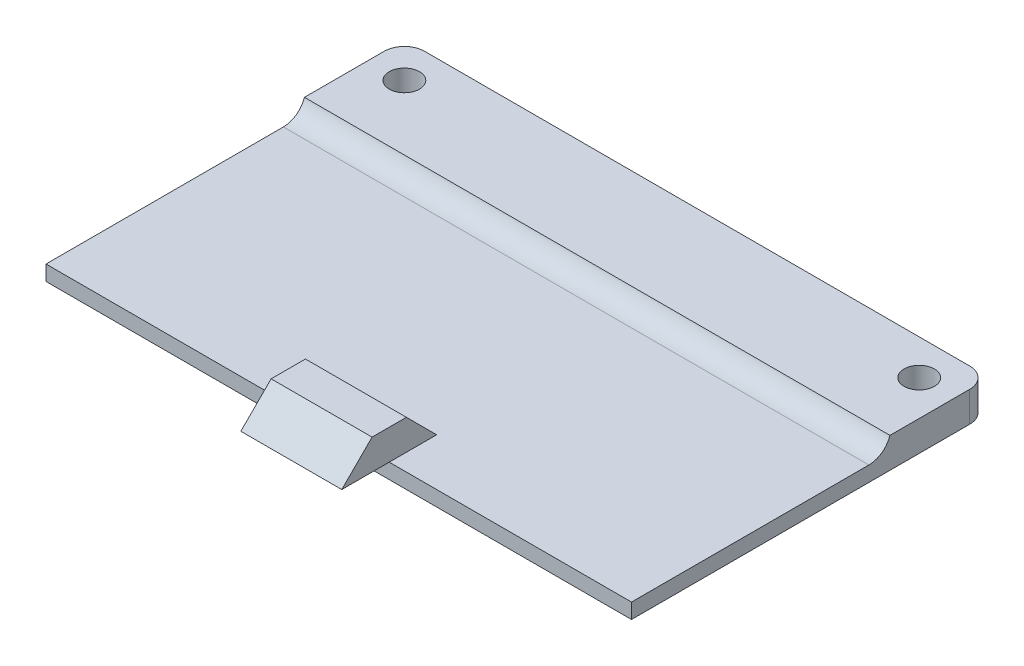
ISO-10303-21;
HEADER;
FILE_DESCRIPTION(('STEP AP214'),'2;1');
FILE_NAME('part.step','',(''),(''),'','','');
FILE_SCHEMA(('AUTOMOTIVE_DESIGN { 1 0 10303 214 1 1 1 1 }'));
ENDSEC;
DATA;
#1=APPLICATION_CONTEXT('core data for automotive mechanical design processes');
#2=APPLICATION_PROTOCOL_DEFINITION('international standard','automotive_design',2000,#1);
#3=PRODUCT_CONTEXT('',#1,'mechanical');
#4=PRODUCT('Part','Part','',(#3));
#5=PRODUCT_RELATED_PRODUCT_CATEGORY('part','',(#4));
#6=PRODUCT_DEFINITION_FORMATION('','',#4);
#7=PRODUCT_DEFINITION_CONTEXT('part definition',#1,'design');
#8=PRODUCT_DEFINITION('design','',#6,#7);
#9=PRODUCT_DEFINITION_SHAPE('','',#8);
#10=(LENGTH_UNIT() NAMED_UNIT(*) SI_UNIT(.MILLI.,.METRE.));
#11=(NAMED_UNIT(*) PLANE_ANGLE_UNIT() SI_UNIT($,.RADIAN.));
#12=(NAMED_UNIT(*) SI_UNIT($,.STERADIAN.) SOLID_ANGLE_UNIT());
#13=UNCERTAINTY_MEASURE_WITH_UNIT(LENGTH_MEASURE(1.E-05),#10,'distance_accuracy_value','');
#14=(GEOMETRIC_REPRESENTATION_CONTEXT(3) GLOBAL_UNCERTAINTY_ASSIGNED_CONTEXT((#13)) GLOBAL_UNIT_ASSIGNED_CONTEXT((#10,
#11,#12)) REPRESENTATION_CONTEXT('',''));
#15=CARTESIAN_POINT('',(0.,0.,0.));
#16=DIRECTION('',(0.,0.,1.));
#17=DIRECTION('',(1.,0.,0.));
#18=AXIS2_PLACEMENT_3D('',#15,#16,#17);
#19=CARTESIAN_POINT('',(0.,1.5,0.));
#20=DIRECTION('',(0.,-1.,0.));
#21=DIRECTION('',(0.,0.,-1.));
#22=AXIS2_PLACEMENT_3D('',#19,#20,#21);
#23=PLANE('',#22);
#24=DIRECTION('',(0.,0.,-1.));
#25=VECTOR('',#24,1.);
#26=CARTESIAN_POINT('',(5.,1.5,0.));
#27=LINE('',#26,#25);
#28=CARTESIAN_POINT('',(5.,1.5,17.75));
#29=VERTEX_POINT('',#28);
#30=CARTESIAN_POINT('',(5.,1.5,13.05));
#31=VERTEX_POINT('',#30);
#32=EDGE_CURVE('E153',#29,#31,#27,.T.);
#33=ORIENTED_EDGE('',*,*,#32,.F.);
#34=DIRECTION('',(1.,0.,0.));
#35=VECTOR('',#34,1.);
#36=CARTESIAN_POINT('',(-29.,1.5,17.75));
#37=LINE('',#36,#35);
#38=CARTESIAN_POINT('',(29.,1.5,17.75));
#39=VERTEX_POINT('',#38);
#40=EDGE_CURVE('E196',#29,#39,#37,.T.);
#41=ORIENTED_EDGE('',*,*,#40,.T.);
#42=DIRECTION('',(0.,0.,-1.));
#43=VECTOR('',#42,1.);
#44=CARTESIAN_POINT('',(29.,1.5,17.75));
#45=LINE('',#44,#43);
#46=CARTESIAN_POINT('',(29.,1.5,-5.76433463853857));
#47=VERTEX_POINT('',#46);
#48=EDGE_CURVE('E190',#39,#47,#45,.T.);
#49=ORIENTED_EDGE('',*,*,#48,.T.);
#50=DIRECTION('',(1.,0.,0.));
#51=VECTOR('',#50,1.);
#52=CARTESIAN_POINT('',(0.,1.5,-5.76433463853857));
#53=LINE('',#52,#51);
#54=CARTESIAN_POINT('',(-29.,1.5,-5.76433463853857));
#55=VERTEX_POINT('',#54);
#56=EDGE_CURVE('E213',#47,#55,#53,.F.);
#57=ORIENTED_EDGE('',*,*,#56,.T.);
#58=DIRECTION('',(0.,0.,1.));
#59=VECTOR('',#58,1.);
#60=CARTESIAN_POINT('',(-29.,1.5,17.75));
#61=LINE('',#60,#59);
#62=CARTESIAN_POINT('',(-29.,1.5,17.75));
#63=VERTEX_POINT('',#62);
#64=EDGE_CURVE('E193',#55,#63,#61,.T.);
#65=ORIENTED_EDGE('',*,*,#64,.T.);
#66=CARTESIAN_POINT('',(-5.00000000000001,1.5,17.75));
#67=VERTEX_POINT('',#66);
#68=EDGE_CURVE('E197',#63,#67,#37,.T.);
#69=ORIENTED_EDGE('',*,*,#68,.T.);
#70=DIRECTION('',(0.,0.,-1.));
#71=VECTOR('',#70,1.);
#72=CARTESIAN_POINT('',(-5.,1.5,0.));
#73=LINE('',#72,#71);
#74=CARTESIAN_POINT('',(-5.,1.5,13.05));
#75=VERTEX_POINT('',#74);
#76=EDGE_CURVE('E165',#67,#75,#73,.T.);
#77=ORIENTED_EDGE('',*,*,#76,.T.);
#78=DIRECTION('',(1.,0.,0.));
#79=VECTOR('',#78,1.);
#80=CARTESIAN_POINT('',(0.,1.5,13.05));
#81=LINE('',#80,#79);
#82=EDGE_CURVE('E152',#75,#31,#81,.T.);
#83=ORIENTED_EDGE('',*,*,#82,.T.);
#84=EDGE_LOOP('',(#33,#41,#49,#57,#65,#69,#77,#83));
#85=FACE_BOUND('',#84,.T.);
#86=ADVANCED_FACE('F33',(#85),#23,.F.);
#87=CARTESIAN_POINT('',(0.,0.,0.));
#88=DIRECTION('',(0.,-1.,0.));
#89=DIRECTION('',(0.,0.,-1.));
#90=AXIS2_PLACEMENT_3D('',#87,#88,#89);
#91=PLANE('',#90);
#92=CARTESIAN_POINT('',(-25.5,0.,-14.25));
#93=DIRECTION('',(0.,1.,0.));
#94=DIRECTION('',(0.,0.,1.));
#95=AXIS2_PLACEMENT_3D('',#92,#93,#94);
#96=CIRCLE('',#95,1.5);
#97=CARTESIAN_POINT('',(-25.5,0.,-12.75));
#98=VERTEX_POINT('',#97);
#99=EDGE_CURVE('E186',#98,#98,#96,.T.);
#100=ORIENTED_EDGE('',*,*,#99,.T.);
#101=EDGE_LOOP('',(#100));
#102=FACE_BOUND('',#101,.T.);
#103=DIRECTION('',(-1.,0.,0.));
#104=VECTOR('',#103,1.);
#105=CARTESIAN_POINT('',(-29.,0.,-17.75));
#106=LINE('',#105,#104);
#107=CARTESIAN_POINT('',(27.,0.,-17.75));
#108=VERTEX_POINT('',#107);
#109=CARTESIAN_POINT('',(-27.,0.,-17.75));
#110=VERTEX_POINT('',#109);
#111=EDGE_CURVE('E202',#108,#110,#106,.T.);
#112=ORIENTED_EDGE('',*,*,#111,.F.);
#113=CARTESIAN_POINT('',(27.,0.,-15.75));
#114=DIRECTION('',(0.,-1.,0.));
#115=DIRECTION('',(0.,0.,-1.));
#116=AXIS2_PLACEMENT_3D('',#113,#114,#115);
#117=CIRCLE('',#116,2.);
#118=CARTESIAN_POINT('',(29.,0.,-15.75));
#119=VERTEX_POINT('',#118);
#120=EDGE_CURVE('E234',#108,#119,#117,.T.);
#121=ORIENTED_EDGE('',*,*,#120,.T.);
#122=DIRECTION('',(0.,0.,-1.));
#123=VECTOR('',#122,1.);
#124=CARTESIAN_POINT('',(29.,0.,17.75));
#125=LINE('',#124,#123);
#126=CARTESIAN_POINT('',(29.,0.,17.75));
#127=VERTEX_POINT('',#126);
#128=EDGE_CURVE('E189',#127,#119,#125,.T.);
#129=ORIENTED_EDGE('',*,*,#128,.F.);
#130=DIRECTION('',(1.,0.,0.));
#131=VECTOR('',#130,1.);
#132=CARTESIAN_POINT('',(-29.,0.,17.75));
#133=LINE('',#132,#131);
#134=CARTESIAN_POINT('',(-29.,0.,17.75));
#135=VERTEX_POINT('',#134);
#136=EDGE_CURVE('E194',#135,#127,#133,.T.);
#137=ORIENTED_EDGE('',*,*,#136,.F.);
#138=DIRECTION('',(0.,0.,1.));
#139=VECTOR('',#138,1.);
#140=CARTESIAN_POINT('',(-29.,0.,17.75));
#141=LINE('',#140,#139);
#142=CARTESIAN_POINT('',(-29.,0.,-15.75));
#143=VERTEX_POINT('',#142);
#144=EDGE_CURVE('E205',#143,#135,#141,.T.);
#145=ORIENTED_EDGE('',*,*,#144,.F.);
#146=CARTESIAN_POINT('',(-27.,0.,-15.75));
#147=DIRECTION('',(0.,-1.,0.));
#148=DIRECTION('',(0.,0.,-1.));
#149=AXIS2_PLACEMENT_3D('',#146,#147,#148);
#150=CIRCLE('',#149,2.);
#151=EDGE_CURVE('E232',#143,#110,#150,.T.);
#152=ORIENTED_EDGE('',*,*,#151,.T.);
#153=EDGE_LOOP('',(#112,#121,#129,#137,#145,#152));
#154=FACE_BOUND('',#153,.T.);
#155=CARTESIAN_POINT('',(25.5,0.,-14.25));
#156=DIRECTION('',(0.,1.,0.));
#157=DIRECTION('',(0.,0.,-1.));
#158=AXIS2_PLACEMENT_3D('',#155,#156,#157);
#159=CIRCLE('',#158,1.5);
#160=CARTESIAN_POINT('',(25.5,0.,-15.75));
#161=VERTEX_POINT('',#160);
#162=EDGE_CURVE('E183',#161,#161,#159,.T.);
#163=ORIENTED_EDGE('',*,*,#162,.T.);
#164=EDGE_LOOP('',(#163));
#165=FACE_BOUND('',#164,.T.);
#166=ADVANCED_FACE('F249',(#102,#154,#165),#91,.T.);
#167=CARTESIAN_POINT('',(29.,1.5,17.75));
#168=DIRECTION('',(-1.,0.,0.));
#169=DIRECTION('',(0.,0.,1.));
#170=AXIS2_PLACEMENT_3D('',#167,#168,#169);
#171=PLANE('',#170);
#172=ORIENTED_EDGE('',*,*,#128,.T.);
#173=DIRECTION('',(0.,-1.,0.));
#174=VECTOR('',#173,1.);
#175=CARTESIAN_POINT('',(29.,1.5,-15.75));
#176=LINE('',#175,#174);
#177=CARTESIAN_POINT('',(29.,3.,-15.75));
#178=VERTEX_POINT('',#177);
#179=EDGE_CURVE('E56',#119,#178,#176,.F.);
#180=ORIENTED_EDGE('',*,*,#179,.T.);
#181=DIRECTION('',(0.,0.,-1.));
#182=VECTOR('',#181,1.);
#183=CARTESIAN_POINT('',(29.,3.,0.));
#184=LINE('',#183,#182);
#185=CARTESIAN_POINT('',(29.,3.,-7.84999999999999));
#186=VERTEX_POINT('',#185);
#187=EDGE_CURVE('E179',#186,#178,#184,.T.);
#188=ORIENTED_EDGE('',*,*,#187,.F.);
#189=CARTESIAN_POINT('',(29.,3.7,-5.76433463853857));
#190=DIRECTION('',(-1.,0.,0.));
#191=DIRECTION('',(0.,0.,1.));
#192=AXIS2_PLACEMENT_3D('',#189,#190,#191);
#193=CIRCLE('',#192,2.2);
#194=EDGE_CURVE('E215',#186,#47,#193,.T.);
#195=ORIENTED_EDGE('',*,*,#194,.T.);
#196=ORIENTED_EDGE('',*,*,#48,.F.);
#197=DIRECTION('',(0.,-1.,0.));
#198=VECTOR('',#197,1.);
#199=CARTESIAN_POINT('',(29.,1.5,17.75));
#200=LINE('',#199,#198);
#201=EDGE_CURVE('E200',#39,#127,#200,.T.);
#202=ORIENTED_EDGE('',*,*,#201,.T.);
#203=EDGE_LOOP('',(#172,#180,#188,#195,#196,#202));
#204=FACE_BOUND('',#203,.T.);
#205=ADVANCED_FACE('F252',(#204),#171,.F.);
#206=CARTESIAN_POINT('',(-29.,1.5,-17.75));
#207=DIRECTION('',(0.,0.,1.));
#208=DIRECTION('',(1.,0.,0.));
#209=AXIS2_PLACEMENT_3D('',#206,#207,#208);
#210=PLANE('',#209);
#211=DIRECTION('',(-1.,0.,0.));
#212=VECTOR('',#211,1.);
#213=CARTESIAN_POINT('',(0.,3.,-17.75));
#214=LINE('',#213,#212);
#215=CARTESIAN_POINT('',(27.,3.,-17.75));
#216=VERTEX_POINT('',#215);
#217=CARTESIAN_POINT('',(-27.,3.,-17.75));
#218=VERTEX_POINT('',#217);
#219=EDGE_CURVE('E181',#216,#218,#214,.T.);
#220=ORIENTED_EDGE('',*,*,#219,.F.);
#221=DIRECTION('',(0.,-1.,0.));
#222=VECTOR('',#221,1.);
#223=CARTESIAN_POINT('',(27.,1.5,-17.75));
#224=LINE('',#223,#222);
#225=EDGE_CURVE('E229',#216,#108,#224,.T.);
#226=ORIENTED_EDGE('',*,*,#225,.T.);
#227=ORIENTED_EDGE('',*,*,#111,.T.);
#228=DIRECTION('',(0.,-1.,0.));
#229=VECTOR('',#228,1.);
#230=CARTESIAN_POINT('',(-27.,1.5,-17.75));
#231=LINE('',#230,#229);
#232=EDGE_CURVE('E227',#110,#218,#231,.F.);
#233=ORIENTED_EDGE('',*,*,#232,.T.);
#234=EDGE_LOOP('',(#220,#226,#227,#233));
#235=FACE_BOUND('',#234,.T.);
#236=ADVANCED_FACE('F243',(#235),#210,.F.);
#237=CARTESIAN_POINT('',(-29.,1.5,17.75));
#238=DIRECTION('',(1.,0.,0.));
#239=DIRECTION('',(0.,0.,-1.));
#240=AXIS2_PLACEMENT_3D('',#237,#238,#239);
#241=PLANE('',#240);
#242=DIRECTION('',(0.,0.,1.));
#243=VECTOR('',#242,1.);
#244=CARTESIAN_POINT('',(-29.,3.,0.));
#245=LINE('',#244,#243);
#246=CARTESIAN_POINT('',(-29.,3.,-15.75));
#247=VERTEX_POINT('',#246);
#248=CARTESIAN_POINT('',(-29.,3.,-7.84999999999999));
#249=VERTEX_POINT('',#248);
#250=EDGE_CURVE('E174',#247,#249,#245,.T.);
#251=ORIENTED_EDGE('',*,*,#250,.F.);
#252=DIRECTION('',(0.,-1.,0.));
#253=VECTOR('',#252,1.);
#254=CARTESIAN_POINT('',(-29.,1.5,-15.75));
#255=LINE('',#254,#253);
#256=EDGE_CURVE('E11',#247,#143,#255,.T.);
#257=ORIENTED_EDGE('',*,*,#256,.T.);
#258=ORIENTED_EDGE('',*,*,#144,.T.);
#259=DIRECTION('',(0.,-1.,0.));
#260=VECTOR('',#259,1.);
#261=CARTESIAN_POINT('',(-29.,1.5,17.75));
#262=LINE('',#261,#260);
#263=EDGE_CURVE('E210',#63,#135,#262,.T.);
#264=ORIENTED_EDGE('',*,*,#263,.F.);
#265=ORIENTED_EDGE('',*,*,#64,.F.);
#266=CARTESIAN_POINT('',(-29.,3.7,-5.76433463853857));
#267=DIRECTION('',(1.,0.,0.));
#268=DIRECTION('',(0.,0.,-1.));
#269=AXIS2_PLACEMENT_3D('',#266,#267,#268);
#270=CIRCLE('',#269,2.2);
#271=EDGE_CURVE('E217',#55,#249,#270,.T.);
#272=ORIENTED_EDGE('',*,*,#271,.T.);
#273=EDGE_LOOP('',(#251,#257,#258,#264,#265,#272));
#274=FACE_BOUND('',#273,.T.);
#275=ADVANCED_FACE('F262',(#274),#241,.F.);
#276=CARTESIAN_POINT('',(-29.,1.5,17.75));
#277=DIRECTION('',(0.,0.,-1.));
#278=DIRECTION('',(-1.,0.,0.));
#279=AXIS2_PLACEMENT_3D('',#276,#277,#278);
#280=PLANE('',#279);
#281=ORIENTED_EDGE('',*,*,#136,.T.);
#282=ORIENTED_EDGE('',*,*,#201,.F.);
#283=ORIENTED_EDGE('',*,*,#40,.F.);
#284=EDGE_CURVE('E151',#67,#29,#37,.T.);
#285=ORIENTED_EDGE('',*,*,#284,.F.);
#286=ORIENTED_EDGE('',*,*,#68,.F.);
#287=ORIENTED_EDGE('',*,*,#263,.T.);
#288=EDGE_LOOP('',(#281,#282,#283,#285,#286,#287));
#289=FACE_BOUND('',#288,.T.);
#290=ADVANCED_FACE('F256',(#289),#280,.F.);
#291=CARTESIAN_POINT('',(-25.5,1.5,-14.25));
#292=DIRECTION('',(0.,-1.,0.));
#293=DIRECTION('',(0.,0.,-1.));
#294=AXIS2_PLACEMENT_3D('',#291,#292,#293);
#295=CYLINDRICAL_SURFACE('',#294,1.5);
#296=ORIENTED_EDGE('',*,*,#99,.F.);
#297=EDGE_LOOP('',(#296));
#298=FACE_BOUND('',#297,.T.);
#299=CARTESIAN_POINT('',(-25.5,3.,-14.25));
#300=DIRECTION('',(0.,1.,0.));
#301=DIRECTION('',(0.,0.,1.));
#302=AXIS2_PLACEMENT_3D('',#299,#300,#301);
#303=CIRCLE('',#302,1.5);
#304=CARTESIAN_POINT('',(-25.5,3.,-12.75));
#305=VERTEX_POINT('',#304);
#306=EDGE_CURVE('E168',#305,#305,#303,.F.);
#307=ORIENTED_EDGE('',*,*,#306,.F.);
#308=EDGE_LOOP('',(#307));
#309=FACE_BOUND('',#308,.T.);
#310=ADVANCED_FACE('F280',(#298,#309),#295,.F.);
#311=CARTESIAN_POINT('',(25.5,1.5,-14.25));
#312=DIRECTION('',(0.,-1.,0.));
#313=DIRECTION('',(0.,0.,-1.));
#314=AXIS2_PLACEMENT_3D('',#311,#312,#313);
#315=CYLINDRICAL_SURFACE('',#314,1.5);
#316=ORIENTED_EDGE('',*,*,#162,.F.);
#317=EDGE_LOOP('',(#316));
#318=FACE_BOUND('',#317,.T.);
#319=CARTESIAN_POINT('',(25.5,3.,-14.25));
#320=DIRECTION('',(0.,1.,0.));
#321=DIRECTION('',(0.,0.,1.));
#322=AXIS2_PLACEMENT_3D('',#319,#320,#321);
#323=CIRCLE('',#322,1.5);
#324=CARTESIAN_POINT('',(25.5,3.,-12.75));
#325=VERTEX_POINT('',#324);
#326=EDGE_CURVE('E171',#325,#325,#323,.F.);
#327=ORIENTED_EDGE('',*,*,#326,.F.);
#328=EDGE_LOOP('',(#327));
#329=FACE_BOUND('',#328,.T.);
#330=ADVANCED_FACE('F325',(#318,#329),#315,.F.);
#331=CARTESIAN_POINT('',(0.,3.,0.));
#332=DIRECTION('',(0.,1.,0.));
#333=DIRECTION('',(0.,0.,1.));
#334=AXIS2_PLACEMENT_3D('',#331,#332,#333);
#335=PLANE('',#334);
#336=ORIENTED_EDGE('',*,*,#306,.T.);
#337=EDGE_LOOP('',(#336));
#338=FACE_BOUND('',#337,.T.);
#339=ORIENTED_EDGE('',*,*,#326,.T.);
#340=EDGE_LOOP('',(#339));
#341=FACE_BOUND('',#340,.T.);
#342=ORIENTED_EDGE('',*,*,#187,.T.);
#343=CARTESIAN_POINT('',(27.,3.,-15.75));
#344=DIRECTION('',(0.,1.,0.));
#345=DIRECTION('',(0.,0.,1.));
#346=AXIS2_PLACEMENT_3D('',#343,#344,#345);
#347=CIRCLE('',#346,2.);
#348=EDGE_CURVE('E41',#178,#216,#347,.T.);
#349=ORIENTED_EDGE('',*,*,#348,.T.);
#350=ORIENTED_EDGE('',*,*,#219,.T.);
#351=CARTESIAN_POINT('',(-27.,3.,-15.75));
#352=DIRECTION('',(0.,1.,0.));
#353=DIRECTION('',(0.,0.,1.));
#354=AXIS2_PLACEMENT_3D('',#351,#352,#353);
#355=CIRCLE('',#354,2.);
#356=EDGE_CURVE('E48',#218,#247,#355,.T.);
#357=ORIENTED_EDGE('',*,*,#356,.T.);
#358=ORIENTED_EDGE('',*,*,#250,.T.);
#359=DIRECTION('',(1.,0.,0.));
#360=VECTOR('',#359,1.);
#361=CARTESIAN_POINT('',(0.,3.,-7.84999999999999));
#362=LINE('',#361,#360);
#363=EDGE_CURVE('E176',#249,#186,#362,.T.);
#364=ORIENTED_EDGE('',*,*,#363,.T.);
#365=EDGE_LOOP('',(#342,#349,#350,#357,#358,#364));
#366=FACE_BOUND('',#365,.T.);
#367=ADVANCED_FACE('F239',(#338,#341,#366),#335,.T.);
#368=CARTESIAN_POINT('',(0.,3.7,-5.76433463853857));
#369=DIRECTION('',(1.,0.,0.));
#370=DIRECTION('',(0.,0.,-1.));
#371=AXIS2_PLACEMENT_3D('',#368,#369,#370);
#372=CYLINDRICAL_SURFACE('',#371,2.2);
#373=ORIENTED_EDGE('',*,*,#271,.F.);
#374=ORIENTED_EDGE('',*,*,#56,.F.);
#375=ORIENTED_EDGE('',*,*,#194,.F.);
#376=ORIENTED_EDGE('',*,*,#363,.F.);
#377=EDGE_LOOP('',(#373,#374,#375,#376));
#378=FACE_BOUND('',#377,.T.);
#379=ADVANCED_FACE('F291',(#378),#372,.F.);
#380=CARTESIAN_POINT('',(0.,1.5,0.));
#381=DIRECTION('',(0.,1.,0.));
#382=DIRECTION('',(0.,0.,1.));
#383=AXIS2_PLACEMENT_3D('',#380,#381,#382);
#384=PLANE('',#383);
#385=CARTESIAN_POINT('',(-5.,1.5,22.45));
#386=VERTEX_POINT('',#385);
#387=EDGE_CURVE('E166',#386,#67,#73,.T.);
#388=ORIENTED_EDGE('',*,*,#387,.T.);
#389=ORIENTED_EDGE('',*,*,#284,.T.);
#390=CARTESIAN_POINT('',(5.,1.5,22.45));
#391=VERTEX_POINT('',#390);
#392=EDGE_CURVE('E135',#391,#29,#27,.T.);
#393=ORIENTED_EDGE('',*,*,#392,.F.);
#394=DIRECTION('',(1.,0.,0.));
#395=VECTOR('',#394,1.);
#396=CARTESIAN_POINT('',(0.,1.5,22.45));
#397=LINE('',#396,#395);
#398=EDGE_CURVE('E149',#386,#391,#397,.T.);
#399=ORIENTED_EDGE('',*,*,#398,.F.);
#400=EDGE_LOOP('',(#388,#389,#393,#399));
#401=FACE_BOUND('',#400,.T.);
#402=ADVANCED_FACE('F148',(#401),#384,.F.);
#403=CARTESIAN_POINT('',(5.,4.5,0.));
#404=DIRECTION('',(-1.,0.,0.));
#405=DIRECTION('',(0.,0.,1.));
#406=AXIS2_PLACEMENT_3D('',#403,#404,#405);
#407=PLANE('',#406);
#408=DIRECTION('',(0.,0.,-1.));
#409=VECTOR('',#408,1.);
#410=CARTESIAN_POINT('',(5.,4.5,0.));
#411=LINE('',#410,#409);
#412=CARTESIAN_POINT('',(5.,4.5,19.45));
#413=VERTEX_POINT('',#412);
#414=CARTESIAN_POINT('',(5.,4.5,16.05));
#415=VERTEX_POINT('',#414);
#416=EDGE_CURVE('E137',#413,#415,#411,.T.);
#417=ORIENTED_EDGE('',*,*,#416,.F.);
#418=DIRECTION('',(0.,-0.70710678118655,0.707106781186545));
#419=VECTOR('',#418,1.);
#420=CARTESIAN_POINT('',(5.,4.5,19.45));
#421=LINE('',#420,#419);
#422=EDGE_CURVE('E131',#413,#391,#421,.T.);
#423=ORIENTED_EDGE('',*,*,#422,.T.);
#424=ORIENTED_EDGE('',*,*,#392,.T.);
#425=ORIENTED_EDGE('',*,*,#32,.T.);
#426=DIRECTION('',(0.,-0.707106781186545,-0.70710678118655));
#427=VECTOR('',#426,1.);
#428=CARTESIAN_POINT('',(5.,1.49999999999999,13.05));
#429=LINE('',#428,#427);
#430=EDGE_CURVE('E143',#31,#415,#429,.F.);
#431=ORIENTED_EDGE('',*,*,#430,.T.);
#432=EDGE_LOOP('',(#417,#423,#424,#425,#431));
#433=FACE_BOUND('',#432,.T.);
#434=ADVANCED_FACE('F133',(#433),#407,.F.);
#435=CARTESIAN_POINT('',(-5.,4.5,0.));
#436=DIRECTION('',(-1.,0.,0.));
#437=DIRECTION('',(0.,0.,1.));
#438=AXIS2_PLACEMENT_3D('',#435,#436,#437);
#439=PLANE('',#438);
#440=ORIENTED_EDGE('',*,*,#387,.F.);
#441=DIRECTION('',(0.,0.70710678118655,-0.707106781186545));
#442=VECTOR('',#441,1.);
#443=CARTESIAN_POINT('',(-5.,14.225,9.72500000000007));
#444=LINE('',#443,#442);
#445=CARTESIAN_POINT('',(-5.,4.5,19.45));
#446=VERTEX_POINT('',#445);
#447=EDGE_CURVE('E157',#386,#446,#444,.T.);
#448=ORIENTED_EDGE('',*,*,#447,.T.);
#449=DIRECTION('',(0.,0.,-1.));
#450=VECTOR('',#449,1.);
#451=CARTESIAN_POINT('',(-5.,4.5,0.));
#452=LINE('',#451,#450);
#453=CARTESIAN_POINT('',(-5.,4.5,16.05));
#454=VERTEX_POINT('',#453);
#455=EDGE_CURVE('E160',#446,#454,#452,.T.);
#456=ORIENTED_EDGE('',*,*,#455,.T.);
#457=DIRECTION('',(0.,0.707106781186545,0.70710678118655));
#458=VECTOR('',#457,1.);
#459=CARTESIAN_POINT('',(-5.,-3.52500000000002,8.02499999999996));
#460=LINE('',#459,#458);
#461=EDGE_CURVE('E142',#454,#75,#460,.F.);
#462=ORIENTED_EDGE('',*,*,#461,.T.);
#463=ORIENTED_EDGE('',*,*,#76,.F.);
#464=EDGE_LOOP('',(#440,#448,#456,#462,#463));
#465=FACE_BOUND('',#464,.T.);
#466=ADVANCED_FACE('F309',(#465),#439,.T.);
#467=CARTESIAN_POINT('',(0.,4.5,0.));
#468=DIRECTION('',(0.,1.,0.));
#469=DIRECTION('',(0.,0.,1.));
#470=AXIS2_PLACEMENT_3D('',#467,#468,#469);
#471=PLANE('',#470);
#472=ORIENTED_EDGE('',*,*,#455,.F.);
#473=DIRECTION('',(1.,0.,0.));
#474=VECTOR('',#473,1.);
#475=CARTESIAN_POINT('',(5.,4.5,19.45));
#476=LINE('',#475,#474);
#477=EDGE_CURVE('E222',#446,#413,#476,.T.);
#478=ORIENTED_EDGE('',*,*,#477,.T.);
#479=ORIENTED_EDGE('',*,*,#416,.T.);
#480=DIRECTION('',(-1.,0.,0.));
#481=VECTOR('',#480,1.);
#482=CARTESIAN_POINT('',(0.,4.5,16.05));
#483=LINE('',#482,#481);
#484=EDGE_CURVE('E220',#415,#454,#483,.T.);
#485=ORIENTED_EDGE('',*,*,#484,.T.);
#486=EDGE_LOOP('',(#472,#478,#479,#485));
#487=FACE_BOUND('',#486,.T.);
#488=ADVANCED_FACE('F297',(#487),#471,.T.);
#489=CARTESIAN_POINT('',(0.,4.5,19.45));
#490=DIRECTION('',(0.,0.707106781186545,0.70710678118655));
#491=DIRECTION('',(-1.,0.,0.));
#492=AXIS2_PLACEMENT_3D('',#489,#490,#491);
#493=PLANE('',#492);
#494=ORIENTED_EDGE('',*,*,#447,.F.);
#495=ORIENTED_EDGE('',*,*,#398,.T.);
#496=ORIENTED_EDGE('',*,*,#422,.F.);
#497=ORIENTED_EDGE('',*,*,#477,.F.);
#498=EDGE_LOOP('',(#494,#495,#496,#497));
#499=FACE_BOUND('',#498,.T.);
#500=ADVANCED_FACE('F156',(#499),#493,.T.);
#501=CARTESIAN_POINT('',(0.,1.49999999999999,13.05));
#502=DIRECTION('',(0.,-0.70710678118655,0.707106781186545));
#503=DIRECTION('',(1.,0.,0.));
#504=AXIS2_PLACEMENT_3D('',#501,#502,#503);
#505=PLANE('',#504);
#506=ORIENTED_EDGE('',*,*,#461,.F.);
#507=ORIENTED_EDGE('',*,*,#484,.F.);
#508=ORIENTED_EDGE('',*,*,#430,.F.);
#509=ORIENTED_EDGE('',*,*,#82,.F.);
#510=EDGE_LOOP('',(#506,#507,#508,#509));
#511=FACE_BOUND('',#510,.T.);
#512=ADVANCED_FACE('F270',(#511),#505,.F.);
#513=CARTESIAN_POINT('',(27.,1.5,-15.75));
#514=DIRECTION('',(0.,-1.,0.));
#515=DIRECTION('',(0.,0.,-1.));
#516=AXIS2_PLACEMENT_3D('',#513,#514,#515);
#517=CYLINDRICAL_SURFACE('',#516,2.);
#518=ORIENTED_EDGE('',*,*,#348,.F.);
#519=ORIENTED_EDGE('',*,*,#179,.F.);
#520=ORIENTED_EDGE('',*,*,#120,.F.);
#521=ORIENTED_EDGE('',*,*,#225,.F.);
#522=EDGE_LOOP('',(#518,#519,#520,#521));
#523=FACE_BOUND('',#522,.T.);
#524=ADVANCED_FACE('F246',(#523),#517,.T.);
#525=CARTESIAN_POINT('',(-27.,1.5,-15.75));
#526=DIRECTION('',(0.,-1.,0.));
#527=DIRECTION('',(0.,0.,-1.));
#528=AXIS2_PLACEMENT_3D('',#525,#526,#527);
#529=CYLINDRICAL_SURFACE('',#528,2.);
#530=ORIENTED_EDGE('',*,*,#356,.F.);
#531=ORIENTED_EDGE('',*,*,#232,.F.);
#532=ORIENTED_EDGE('',*,*,#151,.F.);
#533=ORIENTED_EDGE('',*,*,#256,.F.);
#534=EDGE_LOOP('',(#530,#531,#532,#533));
#535=FACE_BOUND('',#534,.T.);
#536=ADVANCED_FACE('F35',(#535),#529,.T.);
#537=CLOSED_SHELL('',(#86,#166,#205,#236,#275,#290,#310,#330,#367,#379,#402,#434,#466,#488,#500,
#512,#524,#536));
#538=MANIFOLD_SOLID_BREP('B2',#537);
#539=ADVANCED_BREP_SHAPE_REPRESENTATION('',(#18,#538),#14);
#540=SHAPE_DEFINITION_REPRESENTATION(#9,#539);
ENDSEC;
END-ISO-10303-21;
